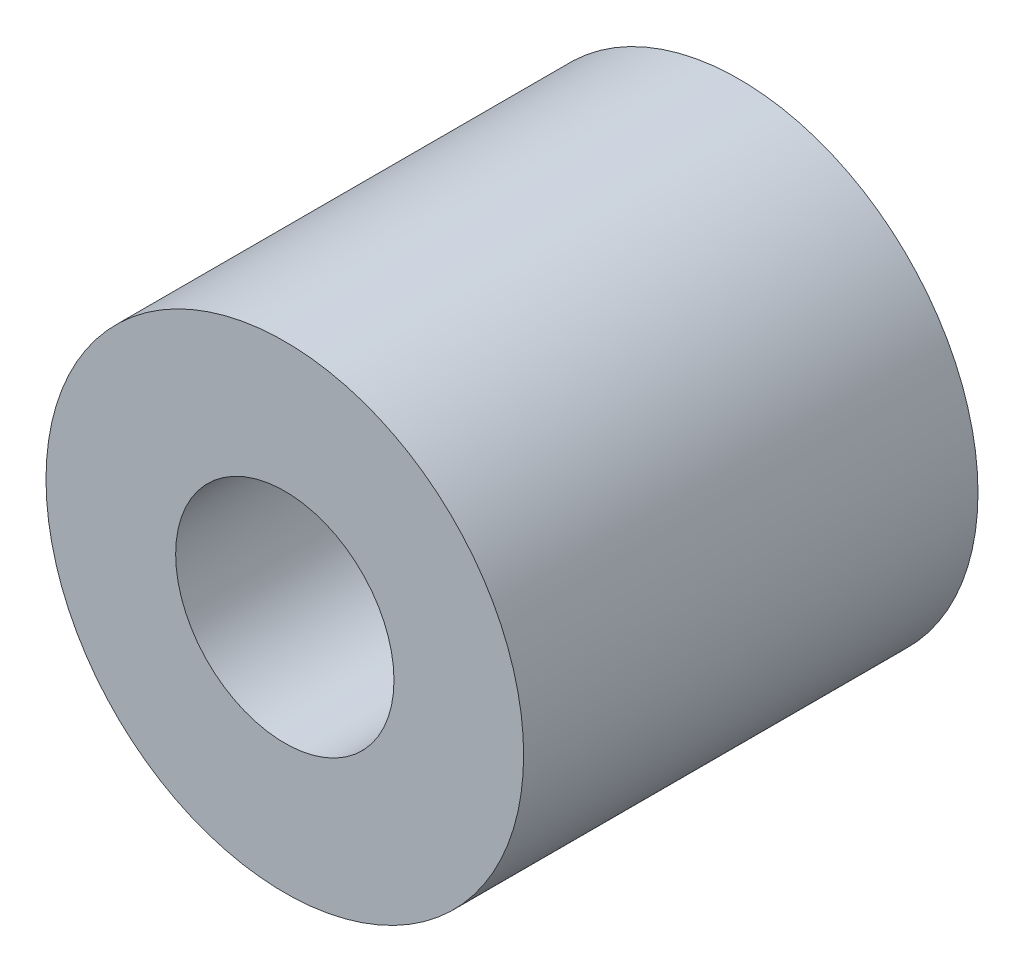
ISO-10303-21;
HEADER;
FILE_DESCRIPTION(('STEP AP214'),'2;1');
FILE_NAME('part.step','',(''),(''),'','','');
FILE_SCHEMA(('AUTOMOTIVE_DESIGN { 1 0 10303 214 1 1 1 1 }'));
ENDSEC;
DATA;
#1=APPLICATION_CONTEXT('core data for automotive mechanical design processes');
#2=APPLICATION_PROTOCOL_DEFINITION('international standard','automotive_design',2000,#1);
#3=PRODUCT_CONTEXT('',#1,'mechanical');
#4=PRODUCT('Part','Part','',(#3));
#5=PRODUCT_RELATED_PRODUCT_CATEGORY('part','',(#4));
#6=PRODUCT_DEFINITION_FORMATION('','',#4);
#7=PRODUCT_DEFINITION_CONTEXT('part definition',#1,'design');
#8=PRODUCT_DEFINITION('design','',#6,#7);
#9=PRODUCT_DEFINITION_SHAPE('','',#8);
#10=(LENGTH_UNIT() NAMED_UNIT(*) SI_UNIT(.MILLI.,.METRE.));
#11=(NAMED_UNIT(*) PLANE_ANGLE_UNIT() SI_UNIT($,.RADIAN.));
#12=(NAMED_UNIT(*) SI_UNIT($,.STERADIAN.) SOLID_ANGLE_UNIT());
#13=UNCERTAINTY_MEASURE_WITH_UNIT(LENGTH_MEASURE(1.E-05),#10,'distance_accuracy_value','');
#14=(GEOMETRIC_REPRESENTATION_CONTEXT(3) GLOBAL_UNCERTAINTY_ASSIGNED_CONTEXT((#13)) GLOBAL_UNIT_ASSIGNED_CONTEXT((#10,
#11,#12)) REPRESENTATION_CONTEXT('',''));
#15=CARTESIAN_POINT('',(0.,0.,0.));
#16=DIRECTION('',(0.,0.,1.));
#17=DIRECTION('',(1.,0.,0.));
#18=AXIS2_PLACEMENT_3D('',#15,#16,#17);
#19=CARTESIAN_POINT('',(0.,0.,0.));
#20=DIRECTION('',(0.,0.,1.));
#21=DIRECTION('',(1.,0.,0.));
#22=AXIS2_PLACEMENT_3D('',#19,#20,#21);
#23=CYLINDRICAL_SURFACE('',#22,1.6);
#24=CARTESIAN_POINT('',(0.,0.,0.));
#25=DIRECTION('',(0.,0.,1.));
#26=DIRECTION('',(1.,0.,0.));
#27=AXIS2_PLACEMENT_3D('',#24,#25,#26);
#28=CIRCLE('',#27,1.6);
#29=CARTESIAN_POINT('',(1.6,0.,0.));
#30=VERTEX_POINT('',#29);
#31=EDGE_CURVE('E27',#30,#30,#28,.T.);
#32=ORIENTED_EDGE('',*,*,#31,.F.);
#33=EDGE_LOOP('',(#32));
#34=FACE_BOUND('',#33,.T.);
#35=CARTESIAN_POINT('',(0.,0.,6.659));
#36=DIRECTION('',(0.,0.,1.));
#37=DIRECTION('',(1.,0.,0.));
#38=AXIS2_PLACEMENT_3D('',#35,#36,#37);
#39=CIRCLE('',#38,1.6);
#40=CARTESIAN_POINT('',(1.6,0.,6.659));
#41=VERTEX_POINT('',#40);
#42=EDGE_CURVE('E18',#41,#41,#39,.T.);
#43=ORIENTED_EDGE('',*,*,#42,.T.);
#44=EDGE_LOOP('',(#43));
#45=FACE_BOUND('',#44,.T.);
#46=ADVANCED_FACE('F15',(#34,#45),#23,.F.);
#47=CARTESIAN_POINT('',(0.,0.,6.659));
#48=DIRECTION('',(0.,0.,-1.));
#49=DIRECTION('',(-1.,0.,0.));
#50=AXIS2_PLACEMENT_3D('',#47,#48,#49);
#51=PLANE('',#50);
#52=ORIENTED_EDGE('',*,*,#42,.F.);
#53=EDGE_LOOP('',(#52));
#54=FACE_BOUND('',#53,.T.);
#55=CARTESIAN_POINT('',(0.,0.,6.659));
#56=DIRECTION('',(0.,0.,1.));
#57=DIRECTION('',(1.,0.,0.));
#58=AXIS2_PLACEMENT_3D('',#55,#56,#57);
#59=CIRCLE('',#58,3.5);
#60=CARTESIAN_POINT('',(3.5,0.,6.659));
#61=VERTEX_POINT('',#60);
#62=EDGE_CURVE('E22',#61,#61,#59,.F.);
#63=ORIENTED_EDGE('',*,*,#62,.F.);
#64=EDGE_LOOP('',(#63));
#65=FACE_BOUND('',#64,.T.);
#66=ADVANCED_FACE('F36',(#54,#65),#51,.F.);
#67=CARTESIAN_POINT('',(0.,0.,0.));
#68=DIRECTION('',(0.,0.,-1.));
#69=DIRECTION('',(-1.,0.,0.));
#70=AXIS2_PLACEMENT_3D('',#67,#68,#69);
#71=PLANE('',#70);
#72=ORIENTED_EDGE('',*,*,#31,.T.);
#73=EDGE_LOOP('',(#72));
#74=FACE_BOUND('',#73,.T.);
#75=CARTESIAN_POINT('',(0.,0.,0.));
#76=DIRECTION('',(0.,0.,1.));
#77=DIRECTION('',(1.,0.,0.));
#78=AXIS2_PLACEMENT_3D('',#75,#76,#77);
#79=CIRCLE('',#78,3.5);
#80=CARTESIAN_POINT('',(3.5,0.,0.));
#81=VERTEX_POINT('',#80);
#82=EDGE_CURVE('E10',#81,#81,#79,.T.);
#83=ORIENTED_EDGE('',*,*,#82,.F.);
#84=EDGE_LOOP('',(#83));
#85=FACE_BOUND('',#84,.T.);
#86=ADVANCED_FACE('F39',(#74,#85),#71,.T.);
#87=CARTESIAN_POINT('',(0.,0.,0.));
#88=DIRECTION('',(0.,0.,1.));
#89=DIRECTION('',(1.,0.,0.));
#90=AXIS2_PLACEMENT_3D('',#87,#88,#89);
#91=CYLINDRICAL_SURFACE('',#90,3.5);
#92=ORIENTED_EDGE('',*,*,#82,.T.);
#93=EDGE_LOOP('',(#92));
#94=FACE_BOUND('',#93,.T.);
#95=ORIENTED_EDGE('',*,*,#62,.T.);
#96=EDGE_LOOP('',(#95));
#97=FACE_BOUND('',#96,.T.);
#98=ADVANCED_FACE('F42',(#94,#97),#91,.T.);
#99=CLOSED_SHELL('',(#46,#66,#86,#98));
#100=MANIFOLD_SOLID_BREP('B1',#99);
#101=ADVANCED_BREP_SHAPE_REPRESENTATION('',(#18,#100),#14);
#102=SHAPE_DEFINITION_REPRESENTATION(#9,#101);
ENDSEC;
END-ISO-10303-21;
